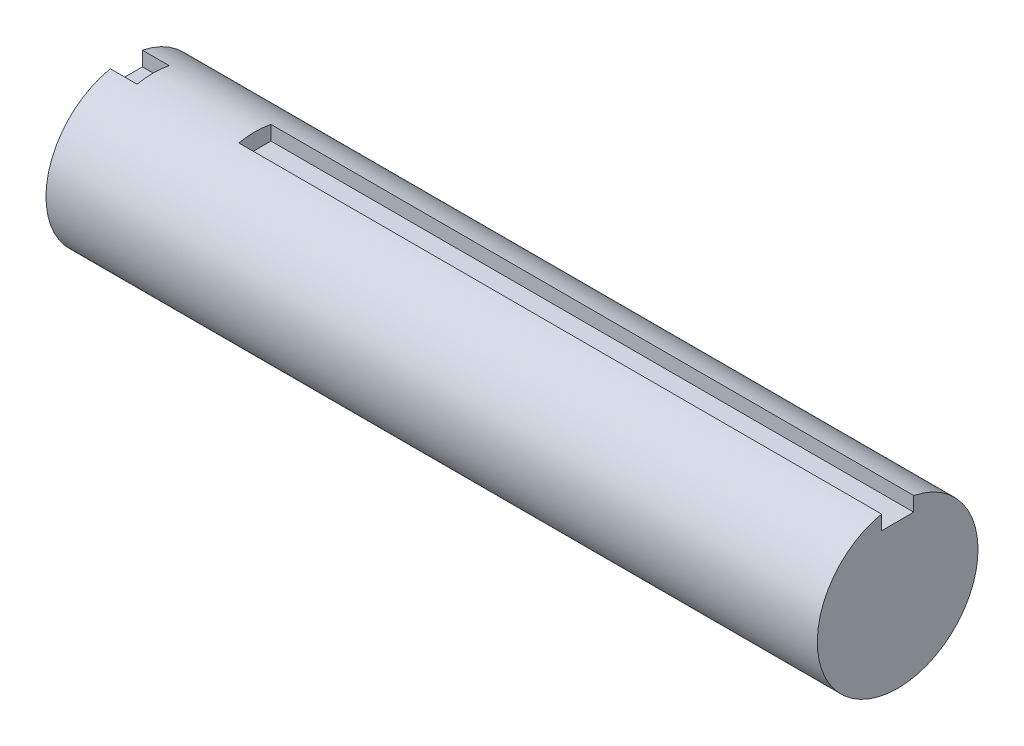
ISO-10303-21;
HEADER;
FILE_DESCRIPTION(('STEP AP214'),'2;1');
FILE_NAME('part.step','',(''),(''),'','','');
FILE_SCHEMA(('AUTOMOTIVE_DESIGN { 1 0 10303 214 1 1 1 1 }'));
ENDSEC;
DATA;
#1=APPLICATION_CONTEXT('core data for automotive mechanical design processes');
#2=APPLICATION_PROTOCOL_DEFINITION('international standard','automotive_design',2000,#1);
#3=PRODUCT_CONTEXT('',#1,'mechanical');
#4=PRODUCT('Part','Part','',(#3));
#5=PRODUCT_RELATED_PRODUCT_CATEGORY('part','',(#4));
#6=PRODUCT_DEFINITION_FORMATION('','',#4);
#7=PRODUCT_DEFINITION_CONTEXT('part definition',#1,'design');
#8=PRODUCT_DEFINITION('design','',#6,#7);
#9=PRODUCT_DEFINITION_SHAPE('','',#8);
#10=(LENGTH_UNIT() NAMED_UNIT(*) SI_UNIT(.MILLI.,.METRE.));
#11=(NAMED_UNIT(*) PLANE_ANGLE_UNIT() SI_UNIT($,.RADIAN.));
#12=(NAMED_UNIT(*) SI_UNIT($,.STERADIAN.) SOLID_ANGLE_UNIT());
#13=UNCERTAINTY_MEASURE_WITH_UNIT(LENGTH_MEASURE(1.E-05),#10,'distance_accuracy_value','');
#14=(GEOMETRIC_REPRESENTATION_CONTEXT(3) GLOBAL_UNCERTAINTY_ASSIGNED_CONTEXT((#13)) GLOBAL_UNIT_ASSIGNED_CONTEXT((#10,
#11,#12)) REPRESENTATION_CONTEXT('',''));
#15=CARTESIAN_POINT('',(0.,0.,0.));
#16=DIRECTION('',(0.,0.,1.));
#17=DIRECTION('',(1.,0.,0.));
#18=AXIS2_PLACEMENT_3D('',#15,#16,#17);
#19=CARTESIAN_POINT('',(365.76,0.,0.));
#20=DIRECTION('',(-1.,0.,0.));
#21=DIRECTION('',(0.,0.,1.));
#22=AXIS2_PLACEMENT_3D('',#19,#20,#21);
#23=CYLINDRICAL_SURFACE('',#22,38.1);
#24=CARTESIAN_POINT('',(0.,0.,0.));
#25=DIRECTION('',(1.,0.,0.));
#26=DIRECTION('',(0.,0.,-1.));
#27=AXIS2_PLACEMENT_3D('',#24,#25,#26);
#28=CIRCLE('',#27,38.1);
#29=CARTESIAN_POINT('',(0.,37.3302236800156,7.61999999999999));
#30=VERTEX_POINT('',#29);
#31=CARTESIAN_POINT('',(0.,37.3302236800156,-7.62000000000001));
#32=VERTEX_POINT('',#31);
#33=EDGE_CURVE('E150',#30,#32,#28,.T.);
#34=ORIENTED_EDGE('',*,*,#33,.T.);
#35=DIRECTION('',(-1.,0.,0.));
#36=VECTOR('',#35,1.);
#37=CARTESIAN_POINT('',(365.76,37.3302236800156,-7.62000000000001));
#38=LINE('',#37,#36);
#39=CARTESIAN_POINT('',(12.7,37.3302236800156,-7.62000000000001));
#40=VERTEX_POINT('',#39);
#41=EDGE_CURVE('E127',#32,#40,#38,.F.);
#42=ORIENTED_EDGE('',*,*,#41,.T.);
#43=CARTESIAN_POINT('',(12.7,0.,0.));
#44=DIRECTION('',(-1.,0.,0.));
#45=DIRECTION('',(0.,0.,1.));
#46=AXIS2_PLACEMENT_3D('',#43,#44,#45);
#47=CIRCLE('',#46,38.1);
#48=CARTESIAN_POINT('',(12.7,37.3302236800156,7.61999999999999));
#49=VERTEX_POINT('',#48);
#50=EDGE_CURVE('E11',#49,#40,#47,.T.);
#51=ORIENTED_EDGE('',*,*,#50,.F.);
#52=DIRECTION('',(-1.,0.,0.));
#53=VECTOR('',#52,1.);
#54=CARTESIAN_POINT('',(365.76,37.3302236800156,7.61999999999999));
#55=LINE('',#54,#53);
#56=EDGE_CURVE('E123',#49,#30,#55,.T.);
#57=ORIENTED_EDGE('',*,*,#56,.T.);
#58=EDGE_LOOP('',(#34,#42,#51,#57));
#59=FACE_BOUND('',#58,.T.);
#60=CARTESIAN_POINT('',(365.76,0.,0.));
#61=DIRECTION('',(1.,0.,0.));
#62=DIRECTION('',(0.,0.,-1.));
#63=AXIS2_PLACEMENT_3D('',#60,#61,#62);
#64=CIRCLE('',#63,38.1);
#65=CARTESIAN_POINT('',(365.76,37.3302236800156,7.61999999999999));
#66=VERTEX_POINT('',#65);
#67=CARTESIAN_POINT('',(365.76,37.3302236800156,-7.62000000000001));
#68=VERTEX_POINT('',#67);
#69=EDGE_CURVE('E151',#66,#68,#64,.T.);
#70=ORIENTED_EDGE('',*,*,#69,.F.);
#71=DIRECTION('',(-1.,0.,0.));
#72=VECTOR('',#71,1.);
#73=CARTESIAN_POINT('',(365.76,37.3302236800156,7.61999999999999));
#74=LINE('',#73,#72);
#75=CARTESIAN_POINT('',(60.96,37.3302236800156,7.61999999999999));
#76=VERTEX_POINT('',#75);
#77=EDGE_CURVE('E147',#66,#76,#74,.T.);
#78=ORIENTED_EDGE('',*,*,#77,.T.);
#79=CARTESIAN_POINT('',(60.96,0.,0.));
#80=DIRECTION('',(1.,0.,0.));
#81=DIRECTION('',(0.,0.,-1.));
#82=AXIS2_PLACEMENT_3D('',#79,#80,#81);
#83=CIRCLE('',#82,38.1);
#84=CARTESIAN_POINT('',(60.96,37.3302236800156,-7.62000000000001));
#85=VERTEX_POINT('',#84);
#86=EDGE_CURVE('E158',#85,#76,#83,.T.);
#87=ORIENTED_EDGE('',*,*,#86,.F.);
#88=DIRECTION('',(-1.,0.,0.));
#89=VECTOR('',#88,1.);
#90=CARTESIAN_POINT('',(365.76,37.3302236800156,-7.62));
#91=LINE('',#90,#89);
#92=EDGE_CURVE('E143',#85,#68,#91,.F.);
#93=ORIENTED_EDGE('',*,*,#92,.T.);
#94=EDGE_LOOP('',(#70,#78,#87,#93));
#95=FACE_BOUND('',#94,.T.);
#96=ADVANCED_FACE('F33',(#59,#95),#23,.T.);
#97=CARTESIAN_POINT('',(365.76,0.,0.));
#98=DIRECTION('',(1.,0.,0.));
#99=DIRECTION('',(0.,0.,-1.));
#100=AXIS2_PLACEMENT_3D('',#97,#98,#99);
#101=PLANE('',#100);
#102=DIRECTION('',(0.,-1.,0.));
#103=VECTOR('',#102,1.);
#104=CARTESIAN_POINT('',(365.76,0.,7.62000000000003));
#105=LINE('',#104,#103);
#106=CARTESIAN_POINT('',(365.76,30.48,7.62));
#107=VERTEX_POINT('',#106);
#108=EDGE_CURVE('E154',#66,#107,#105,.T.);
#109=ORIENTED_EDGE('',*,*,#108,.F.);
#110=ORIENTED_EDGE('',*,*,#69,.T.);
#111=DIRECTION('',(0.,1.,0.));
#112=VECTOR('',#111,1.);
#113=CARTESIAN_POINT('',(365.76,45.72,-7.62000000000002));
#114=LINE('',#113,#112);
#115=CARTESIAN_POINT('',(365.76,30.48,-7.62));
#116=VERTEX_POINT('',#115);
#117=EDGE_CURVE('E133',#116,#68,#114,.T.);
#118=ORIENTED_EDGE('',*,*,#117,.F.);
#119=DIRECTION('',(0.,0.,-1.));
#120=VECTOR('',#119,1.);
#121=CARTESIAN_POINT('',(365.76,30.48,7.62));
#122=LINE('',#121,#120);
#123=EDGE_CURVE('E129',#107,#116,#122,.T.);
#124=ORIENTED_EDGE('',*,*,#123,.F.);
#125=EDGE_LOOP('',(#109,#110,#118,#124));
#126=FACE_BOUND('',#125,.T.);
#127=ADVANCED_FACE('F177',(#126),#101,.T.);
#128=CARTESIAN_POINT('',(0.,0.,0.));
#129=DIRECTION('',(1.,0.,0.));
#130=DIRECTION('',(0.,0.,-1.));
#131=AXIS2_PLACEMENT_3D('',#128,#129,#130);
#132=PLANE('',#131);
#133=DIRECTION('',(0.,0.,1.));
#134=VECTOR('',#133,1.);
#135=CARTESIAN_POINT('',(0.,30.48,-7.62000000000001));
#136=LINE('',#135,#134);
#137=CARTESIAN_POINT('',(0.,30.48,-7.62000000000001));
#138=VERTEX_POINT('',#137);
#139=CARTESIAN_POINT('',(0.,30.48,7.61999999999999));
#140=VERTEX_POINT('',#139);
#141=EDGE_CURVE('E120',#138,#140,#136,.T.);
#142=ORIENTED_EDGE('',*,*,#141,.F.);
#143=DIRECTION('',(0.,1.,0.));
#144=VECTOR('',#143,1.);
#145=CARTESIAN_POINT('',(0.,0.,-7.62));
#146=LINE('',#145,#144);
#147=EDGE_CURVE('E40',#138,#32,#146,.T.);
#148=ORIENTED_EDGE('',*,*,#147,.T.);
#149=ORIENTED_EDGE('',*,*,#33,.F.);
#150=DIRECTION('',(0.,1.,0.));
#151=VECTOR('',#150,1.);
#152=CARTESIAN_POINT('',(0.,45.72,7.61999999999999));
#153=LINE('',#152,#151);
#154=EDGE_CURVE('E107',#140,#30,#153,.T.);
#155=ORIENTED_EDGE('',*,*,#154,.F.);
#156=EDGE_LOOP('',(#142,#148,#149,#155));
#157=FACE_BOUND('',#156,.T.);
#158=ADVANCED_FACE('F161',(#157),#132,.F.);
#159=CARTESIAN_POINT('',(60.96,0.,0.));
#160=DIRECTION('',(1.,0.,0.));
#161=DIRECTION('',(0.,0.,-1.));
#162=AXIS2_PLACEMENT_3D('',#159,#160,#161);
#163=PLANE('',#162);
#164=ORIENTED_EDGE('',*,*,#86,.T.);
#165=DIRECTION('',(0.,-1.,0.));
#166=VECTOR('',#165,1.);
#167=CARTESIAN_POINT('',(60.96,45.72,7.61999999999998));
#168=LINE('',#167,#166);
#169=CARTESIAN_POINT('',(60.96,30.48,7.62));
#170=VERTEX_POINT('',#169);
#171=EDGE_CURVE('E130',#76,#170,#168,.T.);
#172=ORIENTED_EDGE('',*,*,#171,.T.);
#173=DIRECTION('',(0.,0.,-1.));
#174=VECTOR('',#173,1.);
#175=CARTESIAN_POINT('',(60.96,30.48,7.62));
#176=LINE('',#175,#174);
#177=CARTESIAN_POINT('',(60.96,30.48,-7.62));
#178=VERTEX_POINT('',#177);
#179=EDGE_CURVE('E132',#170,#178,#176,.T.);
#180=ORIENTED_EDGE('',*,*,#179,.T.);
#181=DIRECTION('',(0.,1.,0.));
#182=VECTOR('',#181,1.);
#183=CARTESIAN_POINT('',(60.96,45.72,-7.62000000000002));
#184=LINE('',#183,#182);
#185=EDGE_CURVE('E136',#178,#85,#184,.T.);
#186=ORIENTED_EDGE('',*,*,#185,.T.);
#187=EDGE_LOOP('',(#164,#172,#180,#186));
#188=FACE_BOUND('',#187,.T.);
#189=ADVANCED_FACE('F186',(#188),#163,.T.);
#190=CARTESIAN_POINT('',(60.96,45.72,7.61999999999998));
#191=DIRECTION('',(0.,0.,1.));
#192=DIRECTION('',(0.,-1.,0.));
#193=AXIS2_PLACEMENT_3D('',#190,#191,#192);
#194=PLANE('',#193);
#195=ORIENTED_EDGE('',*,*,#108,.T.);
#196=DIRECTION('',(1.,0.,0.));
#197=VECTOR('',#196,1.);
#198=CARTESIAN_POINT('',(60.96,30.48,7.62));
#199=LINE('',#198,#197);
#200=EDGE_CURVE('E55',#170,#107,#199,.T.);
#201=ORIENTED_EDGE('',*,*,#200,.F.);
#202=ORIENTED_EDGE('',*,*,#171,.F.);
#203=ORIENTED_EDGE('',*,*,#77,.F.);
#204=EDGE_LOOP('',(#195,#201,#202,#203));
#205=FACE_BOUND('',#204,.T.);
#206=ADVANCED_FACE('F189',(#205),#194,.F.);
#207=CARTESIAN_POINT('',(60.96,45.72,-7.62000000000002));
#208=DIRECTION('',(0.,0.,-1.));
#209=DIRECTION('',(0.,1.,0.));
#210=AXIS2_PLACEMENT_3D('',#207,#208,#209);
#211=PLANE('',#210);
#212=ORIENTED_EDGE('',*,*,#185,.F.);
#213=DIRECTION('',(1.,0.,0.));
#214=VECTOR('',#213,1.);
#215=CARTESIAN_POINT('',(60.96,30.48,-7.62));
#216=LINE('',#215,#214);
#217=EDGE_CURVE('E141',#178,#116,#216,.T.);
#218=ORIENTED_EDGE('',*,*,#217,.T.);
#219=ORIENTED_EDGE('',*,*,#117,.T.);
#220=ORIENTED_EDGE('',*,*,#92,.F.);
#221=EDGE_LOOP('',(#212,#218,#219,#220));
#222=FACE_BOUND('',#221,.T.);
#223=ADVANCED_FACE('F192',(#222),#211,.F.);
#224=CARTESIAN_POINT('',(60.96,30.48,7.62));
#225=DIRECTION('',(0.,-1.,0.));
#226=DIRECTION('',(0.,0.,-1.));
#227=AXIS2_PLACEMENT_3D('',#224,#225,#226);
#228=PLANE('',#227);
#229=ORIENTED_EDGE('',*,*,#123,.T.);
#230=ORIENTED_EDGE('',*,*,#217,.F.);
#231=ORIENTED_EDGE('',*,*,#179,.F.);
#232=ORIENTED_EDGE('',*,*,#200,.T.);
#233=EDGE_LOOP('',(#229,#230,#231,#232));
#234=FACE_BOUND('',#233,.T.);
#235=ADVANCED_FACE('F194',(#234),#228,.F.);
#236=CARTESIAN_POINT('',(12.7,0.,0.));
#237=DIRECTION('',(-1.,0.,0.));
#238=DIRECTION('',(0.,0.,1.));
#239=AXIS2_PLACEMENT_3D('',#236,#237,#238);
#240=PLANE('',#239);
#241=ORIENTED_EDGE('',*,*,#50,.T.);
#242=DIRECTION('',(0.,-1.,0.));
#243=VECTOR('',#242,1.);
#244=CARTESIAN_POINT('',(12.7,45.72,-7.62000000000001));
#245=LINE('',#244,#243);
#246=CARTESIAN_POINT('',(12.7,30.48,-7.62000000000001));
#247=VERTEX_POINT('',#246);
#248=EDGE_CURVE('E100',#40,#247,#245,.T.);
#249=ORIENTED_EDGE('',*,*,#248,.T.);
#250=DIRECTION('',(0.,0.,1.));
#251=VECTOR('',#250,1.);
#252=CARTESIAN_POINT('',(12.7,30.48,-7.62000000000001));
#253=LINE('',#252,#251);
#254=CARTESIAN_POINT('',(12.7,30.48,7.61999999999999));
#255=VERTEX_POINT('',#254);
#256=EDGE_CURVE('E103',#247,#255,#253,.T.);
#257=ORIENTED_EDGE('',*,*,#256,.T.);
#258=DIRECTION('',(0.,1.,0.));
#259=VECTOR('',#258,1.);
#260=CARTESIAN_POINT('',(12.7,45.72,7.61999999999999));
#261=LINE('',#260,#259);
#262=EDGE_CURVE('E113',#255,#49,#261,.T.);
#263=ORIENTED_EDGE('',*,*,#262,.T.);
#264=EDGE_LOOP('',(#241,#249,#257,#263));
#265=FACE_BOUND('',#264,.T.);
#266=ADVANCED_FACE('F101',(#265),#240,.T.);
#267=CARTESIAN_POINT('',(12.7,45.72,-7.62000000000001));
#268=DIRECTION('',(0.,0.,-1.));
#269=DIRECTION('',(0.,1.,0.));
#270=AXIS2_PLACEMENT_3D('',#267,#268,#269);
#271=PLANE('',#270);
#272=ORIENTED_EDGE('',*,*,#147,.F.);
#273=DIRECTION('',(-1.,0.,0.));
#274=VECTOR('',#273,1.);
#275=CARTESIAN_POINT('',(12.7,30.48,-7.62000000000001));
#276=LINE('',#275,#274);
#277=EDGE_CURVE('E47',#247,#138,#276,.T.);
#278=ORIENTED_EDGE('',*,*,#277,.F.);
#279=ORIENTED_EDGE('',*,*,#248,.F.);
#280=ORIENTED_EDGE('',*,*,#41,.F.);
#281=EDGE_LOOP('',(#272,#278,#279,#280));
#282=FACE_BOUND('',#281,.T.);
#283=ADVANCED_FACE('F109',(#282),#271,.F.);
#284=CARTESIAN_POINT('',(12.7,45.72,7.61999999999999));
#285=DIRECTION('',(0.,0.,1.));
#286=DIRECTION('',(0.,-1.,0.));
#287=AXIS2_PLACEMENT_3D('',#284,#285,#286);
#288=PLANE('',#287);
#289=ORIENTED_EDGE('',*,*,#262,.F.);
#290=DIRECTION('',(-1.,0.,0.));
#291=VECTOR('',#290,1.);
#292=CARTESIAN_POINT('',(12.7,30.48,7.61999999999999));
#293=LINE('',#292,#291);
#294=EDGE_CURVE('E112',#255,#140,#293,.T.);
#295=ORIENTED_EDGE('',*,*,#294,.T.);
#296=ORIENTED_EDGE('',*,*,#154,.T.);
#297=ORIENTED_EDGE('',*,*,#56,.F.);
#298=EDGE_LOOP('',(#289,#295,#296,#297));
#299=FACE_BOUND('',#298,.T.);
#300=ADVANCED_FACE('F166',(#299),#288,.F.);
#301=CARTESIAN_POINT('',(12.7,30.48,-7.62000000000001));
#302=DIRECTION('',(0.,-1.,0.));
#303=DIRECTION('',(0.,0.,-1.));
#304=AXIS2_PLACEMENT_3D('',#301,#302,#303);
#305=PLANE('',#304);
#306=ORIENTED_EDGE('',*,*,#141,.T.);
#307=ORIENTED_EDGE('',*,*,#294,.F.);
#308=ORIENTED_EDGE('',*,*,#256,.F.);
#309=ORIENTED_EDGE('',*,*,#277,.T.);
#310=EDGE_LOOP('',(#306,#307,#308,#309));
#311=FACE_BOUND('',#310,.T.);
#312=ADVANCED_FACE('F115',(#311),#305,.F.);
#313=CLOSED_SHELL('',(#96,#127,#158,#189,#206,#223,#235,#266,#283,#300,#312));
#314=MANIFOLD_SOLID_BREP('B2',#313);
#315=ADVANCED_BREP_SHAPE_REPRESENTATION('',(#18,#314),#14);
#316=SHAPE_DEFINITION_REPRESENTATION(#9,#315);
ENDSEC;
END-ISO-10303-21;
